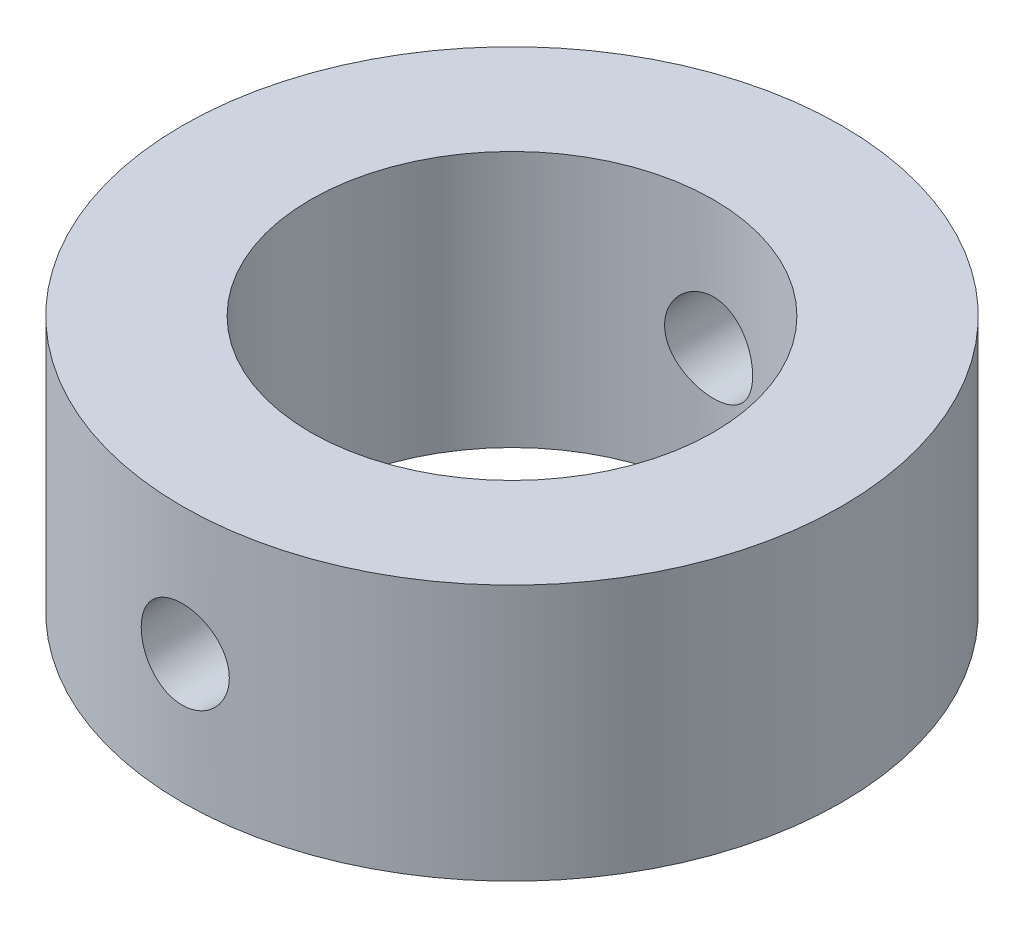
ISO-10303-21;
HEADER;
FILE_DESCRIPTION(('STEP AP214'),'2;1');
FILE_NAME('part.step','',(''),(''),'','','');
FILE_SCHEMA(('AUTOMOTIVE_DESIGN { 1 0 10303 214 1 1 1 1 }'));
ENDSEC;
DATA;
#1=APPLICATION_CONTEXT('core data for automotive mechanical design processes');
#2=APPLICATION_PROTOCOL_DEFINITION('international standard','automotive_design',2000,#1);
#3=PRODUCT_CONTEXT('',#1,'mechanical');
#4=PRODUCT('Part','Part','',(#3));
#5=PRODUCT_RELATED_PRODUCT_CATEGORY('part','',(#4));
#6=PRODUCT_DEFINITION_FORMATION('','',#4);
#7=PRODUCT_DEFINITION_CONTEXT('part definition',#1,'design');
#8=PRODUCT_DEFINITION('design','',#6,#7);
#9=PRODUCT_DEFINITION_SHAPE('','',#8);
#10=(LENGTH_UNIT() NAMED_UNIT(*) SI_UNIT(.MILLI.,.METRE.));
#11=(NAMED_UNIT(*) PLANE_ANGLE_UNIT() SI_UNIT($,.RADIAN.));
#12=(NAMED_UNIT(*) SI_UNIT($,.STERADIAN.) SOLID_ANGLE_UNIT());
#13=UNCERTAINTY_MEASURE_WITH_UNIT(LENGTH_MEASURE(1.E-05),#10,'distance_accuracy_value','');
#14=(GEOMETRIC_REPRESENTATION_CONTEXT(3) GLOBAL_UNCERTAINTY_ASSIGNED_CONTEXT((#13)) GLOBAL_UNIT_ASSIGNED_CONTEXT((#10,
#11,#12)) REPRESENTATION_CONTEXT('',''));
#15=CARTESIAN_POINT('',(0.,0.,0.));
#16=DIRECTION('',(0.,0.,1.));
#17=DIRECTION('',(1.,0.,0.));
#18=AXIS2_PLACEMENT_3D('',#15,#16,#17);
#19=CARTESIAN_POINT('',(0.,14.,0.));
#20=DIRECTION('',(0.,1.,0.));
#21=DIRECTION('',(0.,0.,1.));
#22=AXIS2_PLACEMENT_3D('',#19,#20,#21);
#23=PLANE('',#22);
#24=CARTESIAN_POINT('',(0.,14.,0.));
#25=DIRECTION('',(0.,1.,0.));
#26=DIRECTION('',(0.,0.,1.));
#27=AXIS2_PLACEMENT_3D('',#24,#25,#26);
#28=CIRCLE('',#27,18.);
#29=CARTESIAN_POINT('',(0.,14.,18.));
#30=VERTEX_POINT('',#29);
#31=EDGE_CURVE('E10',#30,#30,#28,.T.);
#32=ORIENTED_EDGE('',*,*,#31,.T.);
#33=EDGE_LOOP('',(#32));
#34=FACE_BOUND('',#33,.T.);
#35=CARTESIAN_POINT('',(0.,14.,0.));
#36=DIRECTION('',(0.,1.,0.));
#37=DIRECTION('',(0.,0.,1.));
#38=AXIS2_PLACEMENT_3D('',#35,#36,#37);
#39=CIRCLE('',#38,11.);
#40=CARTESIAN_POINT('',(0.,14.,11.));
#41=VERTEX_POINT('',#40);
#42=EDGE_CURVE('E50',#41,#41,#39,.T.);
#43=ORIENTED_EDGE('',*,*,#42,.F.);
#44=EDGE_LOOP('',(#43));
#45=FACE_BOUND('',#44,.T.);
#46=ADVANCED_FACE('F32',(#34,#45),#23,.T.);
#47=CARTESIAN_POINT('',(0.,0.,0.));
#48=DIRECTION('',(0.,1.,0.));
#49=DIRECTION('',(0.,0.,1.));
#50=AXIS2_PLACEMENT_3D('',#47,#48,#49);
#51=PLANE('',#50);
#52=CARTESIAN_POINT('',(0.,0.,0.));
#53=DIRECTION('',(0.,1.,0.));
#54=DIRECTION('',(0.,0.,1.));
#55=AXIS2_PLACEMENT_3D('',#52,#53,#54);
#56=CIRCLE('',#55,18.);
#57=CARTESIAN_POINT('',(0.,0.,18.));
#58=VERTEX_POINT('',#57);
#59=EDGE_CURVE('E45',#58,#58,#56,.T.);
#60=ORIENTED_EDGE('',*,*,#59,.F.);
#61=EDGE_LOOP('',(#60));
#62=FACE_BOUND('',#61,.T.);
#63=CARTESIAN_POINT('',(0.,0.,0.));
#64=DIRECTION('',(0.,1.,0.));
#65=DIRECTION('',(0.,0.,1.));
#66=AXIS2_PLACEMENT_3D('',#63,#64,#65);
#67=CIRCLE('',#66,11.);
#68=CARTESIAN_POINT('',(0.,0.,11.));
#69=VERTEX_POINT('',#68);
#70=EDGE_CURVE('E53',#69,#69,#67,.T.);
#71=ORIENTED_EDGE('',*,*,#70,.T.);
#72=EDGE_LOOP('',(#71));
#73=FACE_BOUND('',#72,.T.);
#74=ADVANCED_FACE('F86',(#62,#73),#51,.F.);
#75=CARTESIAN_POINT('',(0.,14.,0.));
#76=DIRECTION('',(0.,-1.,0.));
#77=DIRECTION('',(0.,0.,-1.));
#78=AXIS2_PLACEMENT_3D('',#75,#76,#77);
#79=CYLINDRICAL_SURFACE('',#78,18.);
#80=CARTESIAN_POINT('',(0.,9.40419518636851,-18.));
#81=CARTESIAN_POINT('',(-0.134402909675661,9.4041895263878,-17.999998022804));
#82=CARTESIAN_POINT('',(-0.268887876598331,9.39288678116429,-17.9984787957574));
#83=CARTESIAN_POINT('',(-0.534110132817522,9.34797940860613,-17.9925644552418));
#84=CARTESIAN_POINT('',(-0.66484345158847,9.31435200093208,-17.9881664042527));
#85=CARTESIAN_POINT('',(-0.918684809940585,9.22580837495953,-17.9769894865157));
#86=CARTESIAN_POINT('',(-1.04179811709146,9.17090705791465,-17.9702122865483));
#87=CARTESIAN_POINT('',(-1.27704218619369,9.04140793786261,-17.9550292525406));
#88=CARTESIAN_POINT('',(-1.38917471162932,8.96681330468474,-17.9466236806605));
#89=CARTESIAN_POINT('',(-1.59999709392872,8.79954706606402,-17.9290624099257));
#90=CARTESIAN_POINT('',(-1.69860838354534,8.70677683656236,-17.919902784145));
#91=CARTESIAN_POINT('',(-1.87891202144109,8.50600478201258,-17.9018971115974));
#92=CARTESIAN_POINT('',(-1.96060347320391,8.39800215036823,-17.8930510814673));
#93=CARTESIAN_POINT('',(-2.10504565771609,8.16931461634919,-17.8766357689477));
#94=CARTESIAN_POINT('',(-2.16772196734186,8.04858231223054,-17.8690715531205));
#95=CARTESIAN_POINT('',(-2.27187933943463,7.79818735767253,-17.8561287998479));
#96=CARTESIAN_POINT('',(-2.31336131778918,7.6685250934055,-17.8507501679571));
#97=CARTESIAN_POINT('',(-2.37371196241599,7.40477015856092,-17.8428255002783));
#98=CARTESIAN_POINT('',(-2.39271394591524,7.27070850317503,-17.8402627713486));
#99=CARTESIAN_POINT('',(-2.40797788886755,7.00127657771045,-17.8382091402811));
#100=CARTESIAN_POINT('',(-2.40424088831466,6.86590636776276,-17.8387180976563));
#101=CARTESIAN_POINT('',(-2.37424222007565,6.59863316161741,-17.8427350578061));
#102=CARTESIAN_POINT('',(-2.34812792753755,6.4667132870608,-17.8462234378392));
#103=CARTESIAN_POINT('',(-2.27434615054616,6.20914496292422,-17.8557755737783));
#104=CARTESIAN_POINT('',(-2.22667817309581,6.08349665686671,-17.8618393885922));
#105=CARTESIAN_POINT('',(-2.110985401575,5.8415833756402,-17.8758812247654));
#106=CARTESIAN_POINT('',(-2.04289708869425,5.72534913766053,-17.883865203344));
#107=CARTESIAN_POINT('',(-1.88834179514941,5.50590045556879,-17.9008432745791));
#108=CARTESIAN_POINT('',(-1.80187385551557,5.40268669125688,-17.9098374199302));
#109=CARTESIAN_POINT('',(-1.61219956890055,5.21135380866757,-17.9279094801919));
#110=CARTESIAN_POINT('',(-1.50886629385422,5.12336047880349,-17.9369874952112));
#111=CARTESIAN_POINT('',(-1.28883018209317,4.9659474590285,-17.9541380713651));
#112=CARTESIAN_POINT('',(-1.17212730663112,4.89652782294919,-17.9622106295857));
#113=CARTESIAN_POINT('',(-0.928563877739315,4.77823062003347,-17.9764467818395));
#114=CARTESIAN_POINT('',(-0.801699163855729,4.729361518691,-17.982609588904));
#115=CARTESIAN_POINT('',(-0.541463599173217,4.65365550875152,-17.9923249321777));
#116=CARTESIAN_POINT('',(-0.408093096852119,4.62681742144915,-17.9958776080331));
#117=CARTESIAN_POINT('',(-0.139718834510877,4.59609966961422,-17.9999541392616));
#118=CARTESIAN_POINT('',(-0.00473522850228249,4.59204683862693,-18.0005008391531));
#119=CARTESIAN_POINT('',(0.263986013014001,4.6065568012091,-17.9985656630603));
#120=CARTESIAN_POINT('',(0.397723678832998,4.62511904314237,-17.9960838609483));
#121=CARTESIAN_POINT('',(0.659641379696378,4.68418832615822,-17.9883847233057));
#122=CARTESIAN_POINT('',(0.787840497849758,4.72461221788794,-17.9831777551701));
#123=CARTESIAN_POINT('',(1.03564058949088,4.82617046882212,-17.970610873135));
#124=CARTESIAN_POINT('',(1.15524123367274,4.88730562071844,-17.9632508768332));
#125=CARTESIAN_POINT('',(1.38321890020288,5.02896584528855,-17.9471406665976));
#126=CARTESIAN_POINT('',(1.49152618583392,5.10960223534401,-17.9383825732665));
#127=CARTESIAN_POINT('',(1.69313177965956,5.28781929644873,-17.9204790044974));
#128=CARTESIAN_POINT('',(1.78642940361382,5.38540073954492,-17.9113335114233));
#129=CARTESIAN_POINT('',(1.95598678479201,5.59550340212277,-17.8936147729776));
#130=CARTESIAN_POINT('',(2.03213132657913,5.70811800231741,-17.8850456535931));
#131=CARTESIAN_POINT('',(2.16442355394526,5.94463997534317,-17.8695194696728));
#132=CARTESIAN_POINT('',(2.22057168735687,6.06854709519289,-17.862562369036));
#133=CARTESIAN_POINT('',(2.31109327727748,6.32377420900908,-17.8510766583747));
#134=CARTESIAN_POINT('',(2.34553029162468,6.45507132839894,-17.8465409658708));
#135=CARTESIAN_POINT('',(2.39185606623191,6.72164957356932,-17.8403918041939));
#136=CARTESIAN_POINT('',(2.40374603714137,6.85693048504649,-17.8387781781226));
#137=CARTESIAN_POINT('',(2.40461586754386,7.12648932422166,-17.8386608530165));
#138=CARTESIAN_POINT('',(2.39377677121566,7.26076669268346,-17.8401325781637));
#139=CARTESIAN_POINT('',(2.34988101070407,7.52557218125477,-17.8459671089652));
#140=CARTESIAN_POINT('',(2.31682435517287,7.65610030282432,-17.8503299134936));
#141=CARTESIAN_POINT('',(2.22949089079203,7.90966968781965,-17.8614471033172));
#142=CARTESIAN_POINT('',(2.17522408767461,8.03271444988355,-17.8682003607921));
#143=CARTESIAN_POINT('',(2.04702855682032,8.267981223766,-17.8833392232777));
#144=CARTESIAN_POINT('',(1.97309944561294,8.38020302444808,-17.8917248601236));
#145=CARTESIAN_POINT('',(1.80701046187046,8.59156212619291,-17.9092635227792));
#146=CARTESIAN_POINT('',(1.71471587682094,8.69059313222423,-17.9184219124302));
#147=CARTESIAN_POINT('',(1.51479885194181,8.87182916073039,-17.936427614613));
#148=CARTESIAN_POINT('',(1.40717282193679,8.95403023110731,-17.9452748536757));
#149=CARTESIAN_POINT('',(1.17910732111693,9.09958215667919,-17.9617043450202));
#150=CARTESIAN_POINT('',(1.05861432318542,9.16284974587909,-17.9692809469428));
#151=CARTESIAN_POINT('',(0.80867610420386,9.26815967624623,-17.9822590284389));
#152=CARTESIAN_POINT('',(0.679240634220725,9.3102247343844,-17.9876628347435));
#153=CARTESIAN_POINT('',(0.457635835144013,9.36203484475127,-17.9944059442382));
#154=CARTESIAN_POINT('',(0.366855081823569,9.37782179357509,-17.9964933185187));
#155=CARTESIAN_POINT('',(0.184062375153735,9.3989038560966,-17.9992910173713));
#156=CARTESIAN_POINT('',(0.0920504327256995,9.40419906280002,-18.0000013541503));
#157=CARTESIAN_POINT('',(0.,9.40419518636851,-18.));
#158=B_SPLINE_CURVE_WITH_KNOTS('',3,(#80,#81,#82,#83,#84,#85,#86,#87,#88,#89,#90,#91,#92,#93,
#94,#95,#96,#97,#98,#99,#100,#101,#102,#103,#104,#105,#106,#107,#108,#109,#110,#111,#112,#113,
#114,#115,#116,#117,#118,#119,#120,#121,#122,#123,#124,#125,#126,#127,#128,#129,#130,#131,#132,
#133,#134,#135,#136,#137,#138,#139,#140,#141,#142,#143,#144,#145,#146,#147,#148,#149,#150,#151,
#152,#153,#154,#155,#156,#157),.UNSPECIFIED.,.T.,.F.,(4,2,2,2,2,2,2,2,2,2,2,2,2,2,2,2,2,2,2,2,2,
2,2,2,2,2,2,2,2,2,2,2,2,2,2,2,2,2,4),(0.,0.402872456728005,0.806156642260637,1.2091588575875,
1.61209624532516,2.01728382669796,2.42249287189329,2.82926798626793,3.23602552085755,
3.64035849746487,4.04467298156945,4.44634496862819,4.84802614358781,5.25096996712785,
5.65393481970366,6.06008548306967,6.46623732355769,6.87255630888564,7.27885355388034,
7.68205874878093,8.08525410873084,8.48692661728587,8.88861450097985,9.29265179725614,
9.69670750702689,10.1034012551088,10.5100858944463,10.9155743952597,11.3210411230044,
11.7232904528582,12.1255396260637,12.5275992697474,12.9296667553041,13.3348000346828,
13.7400283408433,14.1470134271144,14.5535615265702,14.8294849631328,15.1054059537167),.UNSPECIFIED.);
#159=CARTESIAN_POINT('',(0.,9.40419518636851,-18.));
#160=VERTEX_POINT('',#159);
#161=EDGE_CURVE('E76',#160,#160,#158,.T.);
#162=ORIENTED_EDGE('',*,*,#161,.T.);
#163=EDGE_LOOP('',(#162));
#164=FACE_BOUND('',#163,.T.);
#165=CARTESIAN_POINT('',(2.40419518636851,7.,17.8387175970091));
#166=CARTESIAN_POINT('',(2.40418952112915,6.86560311887629,17.8387196409227));
#167=CARTESIAN_POINT('',(2.39288775560959,6.73112416327881,17.8402528262396));
#168=CARTESIAN_POINT('',(2.34798462786063,6.46591439540802,17.846217004814));
#169=CARTESIAN_POINT('',(2.314360463885,6.33518755841768,17.8506509610656));
#170=CARTESIAN_POINT('',(2.22582632511201,6.08135991146843,17.8619057093574));
#171=CARTESIAN_POINT('',(2.1709314052546,5.95825377906642,17.8687248129151));
#172=CARTESIAN_POINT('',(2.04144735425953,5.72302175213999,17.8839794931254));
#173=CARTESIAN_POINT('',(1.9668613774692,5.61089410289209,17.8924148108145));
#174=CARTESIAN_POINT('',(1.79960391838219,5.40006629849917,17.9100116316948));
#175=CARTESIAN_POINT('',(1.70683187492632,5.30144623528562,17.9191769963174));
#176=CARTESIAN_POINT('',(1.5060524974238,5.12112564011887,17.9371665710491));
#177=CARTESIAN_POINT('',(1.39804438084255,5.03942597774072,17.9459907636058));
#178=CARTESIAN_POINT('',(1.16935195768186,4.89497514057198,17.9623435903428));
#179=CARTESIAN_POINT('',(1.04862119299675,4.83229689928055,17.9698671914217));
#180=CARTESIAN_POINT('',(0.798229581593046,4.72813553245386,17.9827285733034));
#181=CARTESIAN_POINT('',(0.668569111645822,4.68665151329101,17.9880664462628));
#182=CARTESIAN_POINT('',(0.404820010485618,4.62629670269534,17.9959277249922));
#183=CARTESIAN_POINT('',(0.270762438391361,4.60729238223268,17.9984677437041));
#184=CARTESIAN_POINT('',(0.00133853311349926,4.59202235021708,18.0005039230233));
#185=CARTESIAN_POINT('',(-0.134027741441803,4.59575562471673,18.0000002193606));
#186=CARTESIAN_POINT('',(-0.401317198814035,4.62574832634919,17.9960190942246));
#187=CARTESIAN_POINT('',(-0.533256819763821,4.65186413165317,17.9925606329673));
#188=CARTESIAN_POINT('',(-0.790863853012043,4.72565575258536,17.9830797983932));
#189=CARTESIAN_POINT('',(-0.916531131949507,4.77333202641024,17.9770573705879));
#190=CARTESIAN_POINT('',(-1.15846767329025,4.88904211304471,17.9630926039775));
#191=CARTESIAN_POINT('',(-1.27470712353671,4.9571375317489,17.9551444693237));
#192=CARTESIAN_POINT('',(-1.49416323017686,5.11170806513161,17.9382164345128));
#193=CARTESIAN_POINT('',(-1.59737920469168,5.19818414154274,17.929236480379));
#194=CARTESIAN_POINT('',(-1.78870314925134,5.38786428476126,17.9111659610591));
#195=CARTESIAN_POINT('',(-1.87668696607524,5.49119359732146,17.9020750795022));
#196=CARTESIAN_POINT('',(-2.03408266779731,5.71121836163113,17.8848761860899));
#197=CARTESIAN_POINT('',(-2.103494478576,5.82791386672141,17.8767681781573));
#198=CARTESIAN_POINT('',(-2.22178601704337,6.07147512347324,17.8624532550841));
#199=CARTESIAN_POINT('',(-2.27065489419373,6.19834620773688,17.8562473450771));
#200=CARTESIAN_POINT('',(-2.34635851170631,6.45859564511261,17.8464582560646));
#201=CARTESIAN_POINT('',(-2.37319447050536,6.59197363795559,17.8428749320295));
#202=CARTESIAN_POINT('',(-2.40390417579597,6.86035166037891,17.8387636020395));
#203=CARTESIAN_POINT('',(-2.40795305373094,6.99533130639282,17.8382122940978));
#204=CARTESIAN_POINT('',(-2.39343659829222,7.26404368490502,17.840165716245));
#205=CARTESIAN_POINT('',(-2.37487181721616,7.39777644777579,17.8426703716975));
#206=CARTESIAN_POINT('',(-2.3158028401304,7.65966834808533,17.8504322023368));
#207=CARTESIAN_POINT('',(-2.27538423446258,7.78784713610387,17.8556786367026));
#208=CARTESIAN_POINT('',(-2.17384334610543,8.03560889931053,17.8683241339554));
#209=CARTESIAN_POINT('',(-2.11272023924093,8.15519153208544,17.8757232825328));
#210=CARTESIAN_POINT('',(-1.97107799287816,8.38315647868382,17.8918960393151));
#211=CARTESIAN_POINT('',(-1.890444482657,8.49146715360608,17.9006776413389));
#212=CARTESIAN_POINT('',(-1.71223112399346,8.69308092265379,17.9186010851019));
#213=CARTESIAN_POINT('',(-1.61465052074229,8.78638334796818,17.9277429428727));
#214=CARTESIAN_POINT('',(-1.40454585890737,8.95595174554782,17.9454288351087));
#215=CARTESIAN_POINT('',(-1.29192825100107,9.03210231832972,17.9539685691755));
#216=CARTESIAN_POINT('',(-1.05539859296844,9.16440511813104,17.9694229284876));
#217=CARTESIAN_POINT('',(-0.931486797732223,9.22055779632776,17.9763375903954));
#218=CARTESIAN_POINT('',(-0.67626211726337,9.31108225743082,17.9877437083179));
#219=CARTESIAN_POINT('',(-0.544972812207559,9.3455195662915,17.9922424482032));
#220=CARTESIAN_POINT('',(-0.278411099552119,9.39184857548327,17.9983401941488));
#221=CARTESIAN_POINT('',(-0.143138898728988,9.40374144414571,17.9999393504754));
#222=CARTESIAN_POINT('',(0.126424418440943,9.40461999102004,18.0000567840976));
#223=CARTESIAN_POINT('',(0.260714980238535,9.39378315875493,17.998598932686));
#224=CARTESIAN_POINT('',(0.525547435431626,9.34988729674025,17.9928138127794));
#225=CARTESIAN_POINT('',(0.656089334157384,9.31682829859021,17.9884865483646));
#226=CARTESIAN_POINT('',(0.909687286793255,9.22948466384855,17.977446548992));
#227=CARTESIAN_POINT('',(1.03274674685421,9.17520977001078,17.9707349091149));
#228=CARTESIAN_POINT('',(1.26803955939746,9.04699348772755,17.9556673931061));
#229=CARTESIAN_POINT('',(1.38027270988521,8.97305173243943,17.9473114863051));
#230=CARTESIAN_POINT('',(1.59163190009809,8.80694852795698,17.9298091324652));
#231=CARTESIAN_POINT('',(1.69065391753013,8.7146552779584,17.9206572531379));
#232=CARTESIAN_POINT('',(1.87187243213963,8.51474466391408,17.90263692844));
#233=CARTESIAN_POINT('',(1.95406495326472,8.40712368877641,17.8937685504647));
#234=CARTESIAN_POINT('',(2.09960730711735,8.17906261292469,17.8772775827094));
#235=CARTESIAN_POINT('',(2.16287243257441,8.05856806529184,17.869660660176));
#236=CARTESIAN_POINT('',(2.26817733218579,7.80862662770416,17.8566013598538));
#237=CARTESIAN_POINT('',(2.31023985193193,7.67918950139714,17.8511566530833));
#238=CARTESIAN_POINT('',(2.36204307335285,7.45759143693355,17.8443597838653));
#239=CARTESIAN_POINT('',(2.3778269236746,7.36681955673816,17.8422547172475));
#240=CARTESIAN_POINT('',(2.39890487205194,7.18404460830521,17.8394329302926));
#241=CARTESIAN_POINT('',(2.40419906620125,7.092041551354,17.8387161972372));
#242=CARTESIAN_POINT('',(2.40419518636851,7.,17.8387175970091));
#243=B_SPLINE_CURVE_WITH_KNOTS('',3,(#165,#166,#167,#168,#169,#170,#171,#172,#173,#174,#175,
#176,#177,#178,#179,#180,#181,#182,#183,#184,#185,#186,#187,#188,#189,#190,#191,#192,#193,#194,
#195,#196,#197,#198,#199,#200,#201,#202,#203,#204,#205,#206,#207,#208,#209,#210,#211,#212,#213,
#214,#215,#216,#217,#218,#219,#220,#221,#222,#223,#224,#225,#226,#227,#228,#229,#230,#231,#232,
#233,#234,#235,#236,#237,#238,#239,#240,#241,#242),.UNSPECIFIED.,.T.,.F.,(4,2,2,2,2,2,2,2,2,2,2,
2,2,2,2,2,2,2,2,2,2,2,2,2,2,2,2,2,2,2,2,2,2,2,2,2,2,2,4),(0.,0.402854345078929,
0.806120829800053,1.20910241182785,1.61201947860928,2.01723076662861,2.42246287414509,
2.82922967624751,3.23597932612609,3.64030055943988,4.04460376281382,4.44633193534391,
4.84806864568285,5.25102983035316,5.65401210438611,6.06013839042749,6.46626629726422,
6.87260844741642,7.27892812503046,7.68212069957521,8.08530342706948,8.48691841103621,
8.88854938379678,9.29259433818722,9.69665729300613,10.1033626067798,10.5100587441956,
10.9155217316384,11.3209637060036,11.7232514945912,12.1255387111338,12.5276414061443,
12.9297516020347,13.3348614663304,13.7400669296978,14.1470596085513,14.5536147422936,
14.829511610302,15.1054059508607),.UNSPECIFIED.);
#244=CARTESIAN_POINT('',(2.40419518636851,7.,17.8387175970091));
#245=VERTEX_POINT('',#244);
#246=EDGE_CURVE('E72',#245,#245,#243,.T.);
#247=ORIENTED_EDGE('',*,*,#246,.T.);
#248=EDGE_LOOP('',(#247));
#249=FACE_BOUND('',#248,.T.);
#250=ORIENTED_EDGE('',*,*,#31,.F.);
#251=EDGE_LOOP('',(#250));
#252=FACE_BOUND('',#251,.T.);
#253=ORIENTED_EDGE('',*,*,#59,.T.);
#254=EDGE_LOOP('',(#253));
#255=FACE_BOUND('',#254,.T.);
#256=ADVANCED_FACE('F34',(#164,#249,#252,#255),#79,.T.);
#257=CARTESIAN_POINT('',(0.,14.,0.));
#258=DIRECTION('',(0.,-1.,0.));
#259=DIRECTION('',(0.,0.,-1.));
#260=AXIS2_PLACEMENT_3D('',#257,#258,#259);
#261=CYLINDRICAL_SURFACE('',#260,11.);
#262=CARTESIAN_POINT('',(0.,9.40419518636851,-11.));
#263=CARTESIAN_POINT('',(-0.133345474822226,9.40419062909923,-10.9999975400844));
#264=CARTESIAN_POINT('',(-0.266746044124557,9.39306399091577,-10.9975506752606));
#265=CARTESIAN_POINT('',(-0.52975815160191,9.34889753073652,-10.9880259858541));
#266=CARTESIAN_POINT('',(-0.659366910176056,9.3158420341455,-10.9809448487746));
#267=CARTESIAN_POINT('',(-0.910956292024676,9.22890251764311,-10.9629400634831));
#268=CARTESIAN_POINT('',(-1.03294472350294,9.17504023811171,-10.9520204270716));
#269=CARTESIAN_POINT('',(-1.26614873297863,9.04808505658846,-10.9275172572127));
#270=CARTESIAN_POINT('',(-1.37736459300546,8.97499265823362,-10.9139337935332));
#271=CARTESIAN_POINT('',(-1.58765291479783,8.81041257091474,-10.8853477064138));
#272=CARTESIAN_POINT('',(-1.68652804672556,8.71867578001747,-10.8703275037491));
#273=CARTESIAN_POINT('',(-1.86761721061673,8.51994575803247,-10.8406847135783));
#274=CARTESIAN_POINT('',(-1.94982975878706,8.41295116969101,-10.826062161583));
#275=CARTESIAN_POINT('',(-2.09613040319014,8.18528408958115,-10.798696969245));
#276=CARTESIAN_POINT('',(-2.16000847894671,8.06447368759022,-10.7859768549993));
#277=CARTESIAN_POINT('',(-2.2664797484557,7.81350925979558,-10.7641090380261));
#278=CARTESIAN_POINT('',(-2.30907548311454,7.68335635152008,-10.7549609088666));
#279=CARTESIAN_POINT('',(-2.37112088792617,7.41954183972089,-10.7414518583969));
#280=CARTESIAN_POINT('',(-2.39091990197836,7.28596617158421,-10.7370187653363));
#281=CARTESIAN_POINT('',(-2.40789607083883,7.01732121154156,-10.7332249531352));
#282=CARTESIAN_POINT('',(-2.40507600192406,6.88225210497317,-10.7338636114855));
#283=CARTESIAN_POINT('',(-2.37717520068272,6.61705114870122,-10.7400758009444));
#284=CARTESIAN_POINT('',(-2.35250025123275,6.48687418151104,-10.7455593712936));
#285=CARTESIAN_POINT('',(-2.28223298243534,6.23255335677272,-10.7607012958921));
#286=CARTESIAN_POINT('',(-2.23663949111248,6.10840983768361,-10.7703598840479));
#287=CARTESIAN_POINT('',(-2.12545663317038,5.86853887574986,-10.7928522453492));
#288=CARTESIAN_POINT('',(-2.05971119259516,5.75288618062185,-10.8057106489451));
#289=CARTESIAN_POINT('',(-1.91020045506305,5.53410451460627,-10.8331387084785));
#290=CARTESIAN_POINT('',(-1.82643270524183,5.43097725144154,-10.8477085972291));
#291=CARTESIAN_POINT('',(-1.64110698892313,5.23783759909056,-10.877303983339));
#292=CARTESIAN_POINT('',(-1.5392039624412,5.14815645001999,-10.8923325256613));
#293=CARTESIAN_POINT('',(-1.32163450809266,4.98710277961137,-10.9208653886596));
#294=CARTESIAN_POINT('',(-1.20596783169232,4.91573058895629,-10.9343696818033));
#295=CARTESIAN_POINT('',(-0.963750440342864,4.79323915430486,-10.9583762082612));
#296=CARTESIAN_POINT('',(-0.837177121471474,4.74216326545735,-10.9688720019103));
#297=CARTESIAN_POINT('',(-0.576964118492669,4.66209712791832,-10.9856310569749));
#298=CARTESIAN_POINT('',(-0.443325463395197,4.63310367252048,-10.9918949329143));
#299=CARTESIAN_POINT('',(-0.175616630849168,4.59850709209895,-10.9993969314591));
#300=CARTESIAN_POINT('',(-0.041607575826319,4.59245148063386,-11.0007322639144));
#301=CARTESIAN_POINT('',(0.225507343154808,4.60267611184991,-10.9984991062023));
#302=CARTESIAN_POINT('',(0.358613267662854,4.61895484196886,-10.9949309481168));
#303=CARTESIAN_POINT('',(0.61864466765043,4.67301086027097,-10.9833530763986));
#304=CARTESIAN_POINT('',(0.745621847756873,4.71055086471981,-10.9753924096367));
#305=CARTESIAN_POINT('',(0.991477062096779,4.80580046988377,-10.9559205328824));
#306=CARTESIAN_POINT('',(1.11035440600934,4.86351178716692,-10.9444090207249));
#307=CARTESIAN_POINT('',(1.33850680732178,4.99840891531374,-10.9188725678397));
#308=CARTESIAN_POINT('',(1.44762083039341,5.07586060409392,-10.9048141378459));
#309=CARTESIAN_POINT('',(1.65146546084491,5.24768973118556,-10.875811752349));
#310=CARTESIAN_POINT('',(1.74619420022124,5.34206936421343,-10.8608676821908));
#311=CARTESIAN_POINT('',(1.92036779363261,5.54715147074604,-10.8314426235525));
#312=CARTESIAN_POINT('',(1.99949934992878,5.65812233332314,-10.8169752153956));
#313=CARTESIAN_POINT('',(2.13800413221102,5.89204442497026,-10.7904555654241));
#314=CARTESIAN_POINT('',(2.19737821262059,6.01499513566744,-10.7784032191779));
#315=CARTESIAN_POINT('',(2.2942820289938,6.26872782204305,-10.7581932659372));
#316=CARTESIAN_POINT('',(2.33193450475538,6.39946109674684,-10.7500138228015));
#317=CARTESIAN_POINT('',(2.38468595356046,6.66560070695832,-10.7384363659103));
#318=CARTESIAN_POINT('',(2.39978852691015,6.80100629295438,-10.735037588881));
#319=CARTESIAN_POINT('',(2.40685841879594,7.0694880652082,-10.7334543307281));
#320=CARTESIAN_POINT('',(2.39932247324612,7.20255075139882,-10.7351578913006));
#321=CARTESIAN_POINT('',(2.36243961043478,7.46546110109579,-10.7433341858523));
#322=CARTESIAN_POINT('',(2.33309294939195,7.59530880235128,-10.7498068638069));
#323=CARTESIAN_POINT('',(2.25366152206053,7.84770941626606,-10.7667375508172));
#324=CARTESIAN_POINT('',(2.20364894366445,7.97028603967343,-10.7771816772193));
#325=CARTESIAN_POINT('',(2.08436740648332,8.20538253767768,-10.8008839403652));
#326=CARTESIAN_POINT('',(2.01509644497114,8.31790136473021,-10.8141423697415));
#327=CARTESIAN_POINT('',(1.85761646279971,8.53213718814393,-10.8423138633169));
#328=CARTESIAN_POINT('',(1.76905339564455,8.6335903006525,-10.857254924738));
#329=CARTESIAN_POINT('',(1.57622077126447,8.82035798004134,-10.8869199443971));
#330=CARTESIAN_POINT('',(1.47194758829262,8.90566881115496,-10.9016438516546));
#331=CARTESIAN_POINT('',(1.24902759049567,9.05878766040772,-10.9294416873438));
#332=CARTESIAN_POINT('',(1.13021213456523,9.12635472810121,-10.9424917811503));
#333=CARTESIAN_POINT('',(0.882650713041727,9.24045202011478,-10.9652325018749));
#334=CARTESIAN_POINT('',(0.753913187645637,9.28699989813703,-10.974925946391));
#335=CARTESIAN_POINT('',(0.520871635500246,9.34943554969008,-10.9881303254897));
#336=CARTESIAN_POINT('',(0.417828901717508,9.36993125313435,-10.9925538956342));
#337=CARTESIAN_POINT('',(0.20986876639113,9.39731256422799,-10.9984896366258));
#338=CARTESIAN_POINT('',(0.10495144788536,9.40419877323195,-11.0000019361115));
#339=CARTESIAN_POINT('',(0.,9.40419518636851,-11.));
#340=B_SPLINE_CURVE_WITH_KNOTS('',3,(#262,#263,#264,#265,#266,#267,#268,#269,#270,#271,#272,
#273,#274,#275,#276,#277,#278,#279,#280,#281,#282,#283,#284,#285,#286,#287,#288,#289,#290,#291,
#292,#293,#294,#295,#296,#297,#298,#299,#300,#301,#302,#303,#304,#305,#306,#307,#308,#309,#310,
#311,#312,#313,#314,#315,#316,#317,#318,#319,#320,#321,#322,#323,#324,#325,#326,#327,#328,#329,
#330,#331,#332,#333,#334,#335,#336,#337,#338,#339),.UNSPECIFIED.,.T.,.F.,(4,2,2,2,2,2,2,2,2,2,2,
2,2,2,2,2,2,2,2,2,2,2,2,2,2,2,2,2,2,2,2,2,2,2,2,2,2,2,4),(0.,0.399652261603197,
0.799590500104639,1.19911198060419,1.59862299867337,2.00387143414728,2.40915594091199,
2.81891288470225,3.22862089576575,3.63196316013708,4.03525591884559,4.43121407500785,
4.82719441770241,5.22632256514819,5.6255050689587,6.03330636545437,6.44111502683926,
6.84979018932323,7.25840599461631,7.65891789656788,8.0594026757474,8.45550356376515,
8.85163816796885,9.25341958741895,9.65525313573388,10.0644804831351,10.4736901309616,
10.8805642660379,11.2873734328434,11.6853220381304,12.0832659686391,12.4798314411986,
12.8764381690233,13.2810505297585,13.6857564146701,14.0957028748939,14.5053043838983,
14.8198702665674,15.1344222493913),.UNSPECIFIED.);
#341=CARTESIAN_POINT('',(0.,9.40419518636851,-11.));
#342=VERTEX_POINT('',#341);
#343=EDGE_CURVE('E37',#342,#342,#340,.T.);
#344=ORIENTED_EDGE('',*,*,#343,.F.);
#345=EDGE_LOOP('',(#344));
#346=FACE_BOUND('',#345,.T.);
#347=CARTESIAN_POINT('',(2.40419518636851,7.,10.7340507501056));
#348=CARTESIAN_POINT('',(2.40419059838666,6.86669740965424,10.7340534442967));
#349=CARTESIAN_POINT('',(2.39307087271794,6.7333396486609,10.7365609556869));
#350=CARTESIAN_POINT('',(2.34893435507288,6.47041640187712,10.7463016653039));
#351=CARTESIAN_POINT('',(2.3159017165744,6.34085373139193,10.7535382833708));
#352=CARTESIAN_POINT('',(2.22902901610703,6.089362004055,10.771879358729));
#353=CARTESIAN_POINT('',(2.17521176557183,5.96742474807567,10.7829795743477));
#354=CARTESIAN_POINT('',(2.04836275908683,5.73430716245537,10.8077920246006));
#355=CARTESIAN_POINT('',(1.97533140518381,5.62312660780166,10.821504204579));
#356=CARTESIAN_POINT('',(1.81081416989867,5.41280125240152,10.8502539772752));
#357=CARTESIAN_POINT('',(1.71906546342858,5.31386431303239,10.865308502817));
#358=CARTESIAN_POINT('',(1.52028529835991,5.13265505257484,10.8948984503776));
#359=CARTESIAN_POINT('',(1.41325265401345,5.05038402564854,10.909433832011));
#360=CARTESIAN_POINT('',(1.18554943218901,4.90401989875041,10.9365321277409));
#361=CARTESIAN_POINT('',(1.06474747954355,4.84012669758062,10.9490727329579));
#362=CARTESIAN_POINT('',(0.813801279481157,4.73362516908576,10.9705772316062));
#363=CARTESIAN_POINT('',(0.683658080664218,4.69101445695895,10.9795415257571));
#364=CARTESIAN_POINT('',(0.419884883726366,4.62894115524104,10.9927637121968));
#365=CARTESIAN_POINT('',(0.286341312110702,4.60912678262392,10.9970930542228));
#366=CARTESIAN_POINT('',(0.0177600559911828,4.59210875811057,11.0008050808282));
#367=CARTESIAN_POINT('',(-0.117277456068783,4.59490252322274,11.0001883305012));
#368=CARTESIAN_POINT('',(-0.382588350041267,4.62275942601665,10.9941322756691));
#369=CARTESIAN_POINT('',(-0.512903694689677,4.64744338704654,10.9887750873282));
#370=CARTESIAN_POINT('',(-0.767496516045422,4.71777578995514,10.9739336550688));
#371=CARTESIAN_POINT('',(-0.891773719738372,4.76342517881147,10.9644492247299));
#372=CARTESIAN_POINT('',(-1.13181534297207,4.87472816637093,10.9422869149877));
#373=CARTESIAN_POINT('',(-1.24751090270665,4.94052553867325,10.9295862011024));
#374=CARTESIAN_POINT('',(-1.46635675194194,5.09014953999941,10.9023839885519));
#375=CARTESIAN_POINT('',(-1.56950533180934,5.17397862169944,10.8878822450238));
#376=CARTESIAN_POINT('',(-1.76258427684077,5.35935088762271,10.8583170449355));
#377=CARTESIAN_POINT('',(-1.85219548608085,5.46122592483005,10.8432481778152));
#378=CARTESIAN_POINT('',(-2.01312096837702,5.67871346680345,10.8145293793635));
#379=CARTESIAN_POINT('',(-2.08443474696953,5.7943263426927,10.8008794863839));
#380=CARTESIAN_POINT('',(-2.20688260981921,6.03652325727243,10.7765298921948));
#381=CARTESIAN_POINT('',(-2.2579564504998,6.16313870115375,10.7658390265023));
#382=CARTESIAN_POINT('',(-2.33800588198396,6.42344408614396,10.7487404553427));
#383=CARTESIAN_POINT('',(-2.36698497244969,6.55713290328851,10.7423320715787));
#384=CARTESIAN_POINT('',(-2.40152739660016,6.82487405238992,10.7346623593293));
#385=CARTESIAN_POINT('',(-2.40755541329454,6.95886357803811,10.7332989040541));
#386=CARTESIAN_POINT('',(-2.3972825837767,7.22593306382084,10.7355979443653));
#387=CARTESIAN_POINT('',(-2.38098326901928,7.35901308570998,10.7392600952401));
#388=CARTESIAN_POINT('',(-2.32692159768468,7.61886836032679,10.7511012838079));
#389=CARTESIAN_POINT('',(-2.28941511778119,7.74569952894783,10.7592264399928));
#390=CARTESIAN_POINT('',(-2.19428081310819,7.99127737843516,10.7790295436888));
#391=CARTESIAN_POINT('',(-2.13665106475343,8.11002328513324,10.7907078308302));
#392=CARTESIAN_POINT('',(-2.00188208176585,8.33807096775223,10.8165257716687));
#393=CARTESIAN_POINT('',(-1.92445655480147,8.44719950140654,10.8307005031557));
#394=CARTESIAN_POINT('',(-1.75266851719769,8.65108537615511,10.8598216483817));
#395=CARTESIAN_POINT('',(-1.6583039065472,8.74584093267917,10.8747681576375));
#396=CARTESIAN_POINT('',(-1.45321376221595,8.92009439035404,10.9040853628543));
#397=CARTESIAN_POINT('',(-1.34221641859282,8.99927550821673,10.9184401651824));
#398=CARTESIAN_POINT('',(-1.10822601588259,9.13786720774745,10.9446641862587));
#399=CARTESIAN_POINT('',(-0.985233516901551,9.19727871197387,10.9565335209828));
#400=CARTESIAN_POINT('',(-0.731509750681124,9.29420337428419,10.9763822317855));
#401=CARTESIAN_POINT('',(-0.600833437088551,9.33185512779438,10.9843861729612));
#402=CARTESIAN_POINT('',(-0.334815726075157,9.38462434548169,10.9957084731027));
#403=CARTESIAN_POINT('',(-0.199475008674611,9.39974508034119,10.9990275121417));
#404=CARTESIAN_POINT('',(0.0690222137089819,9.4068761692174,11.0005858870613));
#405=CARTESIAN_POINT('',(0.20216577271646,9.39935952534689,10.998929191603));
#406=CARTESIAN_POINT('',(0.465243078377383,9.3624871124751,10.9909449650638));
#407=CARTESIAN_POINT('',(0.5951768825176,9.33313173489939,10.9846175176988));
#408=CARTESIAN_POINT('',(0.847781146811231,9.25364166918495,10.9680103931837));
#409=CARTESIAN_POINT('',(0.970473579967009,9.2035739737615,10.9577434657279));
#410=CARTESIAN_POINT('',(1.20577928865063,9.08414586659116,10.934353817535));
#411=CARTESIAN_POINT('',(1.31839158599222,9.01478358515571,10.9212308200651));
#412=CARTESIAN_POINT('',(1.53264782661987,8.85719245755773,10.8932501261464));
#413=CARTESIAN_POINT('',(1.63404342475026,8.76863093902911,10.8783642651473));
#414=CARTESIAN_POINT('',(1.82069579893534,8.57582639722507,10.8486874655186));
#415=CARTESIAN_POINT('',(1.90594867962535,8.47157959983202,10.83389655063));
#416=CARTESIAN_POINT('',(2.05899159488594,8.24869057963131,10.8058643108439));
#417=CARTESIAN_POINT('',(2.12653337957298,8.1298748000206,10.7926463018462));
#418=CARTESIAN_POINT('',(2.24058331847492,7.8823154906366,10.769549590448));
#419=CARTESIAN_POINT('',(2.28710928536613,7.75358047700978,10.7596680619));
#420=CARTESIAN_POINT('',(2.3494942656627,7.52059421780658,10.7461913284028));
#421=CARTESIAN_POINT('',(2.36996779361555,7.41760734229239,10.7416688113789));
#422=CARTESIAN_POINT('',(2.39731972886495,7.20975830447388,10.7355975344348));
#423=CARTESIAN_POINT('',(2.40419879666606,7.10489623352817,10.734048630038));
#424=CARTESIAN_POINT('',(2.40419518636851,7.,10.7340507501056));
#425=B_SPLINE_CURVE_WITH_KNOTS('',3,(#347,#348,#349,#350,#351,#352,#353,#354,#355,#356,#357,
#358,#359,#360,#361,#362,#363,#364,#365,#366,#367,#368,#369,#370,#371,#372,#373,#374,#375,#376,
#377,#378,#379,#380,#381,#382,#383,#384,#385,#386,#387,#388,#389,#390,#391,#392,#393,#394,#395,
#396,#397,#398,#399,#400,#401,#402,#403,#404,#405,#406,#407,#408,#409,#410,#411,#412,#413,#414,
#415,#416,#417,#418,#419,#420,#421,#422,#423,#424),.UNSPECIFIED.,.T.,.F.,(4,2,2,2,2,2,2,2,2,2,2,
2,2,2,2,2,2,2,2,2,2,2,2,2,2,2,2,2,2,2,2,2,2,2,2,2,2,2,4),(0.,0.399523336463805,0.79933590727869,
1.19871091889099,1.598077574419,2.00349466761906,2.40894323071266,2.81864819280548,
3.2283072352491,3.63155602953158,4.03475875307852,4.43111081782042,4.82748078696464,
5.22674785470178,5.62606926519456,6.033687228658,6.44131620629143,6.85014952703765,
7.25891807783217,7.65936500369588,8.05978446386518,8.45547268322543,8.8511987368214,
9.25300812166115,9.6548673549862,10.0642056471128,10.4735248345943,10.8802073463053,
11.2868308167911,11.685017354288,12.0831967550782,12.4800982155743,12.877038150116,
13.2815015419813,13.686062410009,14.096022667516,14.5056347941322,14.8200362579055,
15.1344224456979),.UNSPECIFIED.);
#426=CARTESIAN_POINT('',(2.40419518636851,7.,10.7340507501056));
#427=VERTEX_POINT('',#426);
#428=EDGE_CURVE('E55',#427,#427,#425,.T.);
#429=ORIENTED_EDGE('',*,*,#428,.F.);
#430=EDGE_LOOP('',(#429));
#431=FACE_BOUND('',#430,.T.);
#432=ORIENTED_EDGE('',*,*,#42,.T.);
#433=EDGE_LOOP('',(#432));
#434=FACE_BOUND('',#433,.T.);
#435=ORIENTED_EDGE('',*,*,#70,.F.);
#436=EDGE_LOOP('',(#435));
#437=FACE_BOUND('',#436,.T.);
#438=ADVANCED_FACE('F59',(#346,#431,#434,#437),#261,.F.);
#439=CARTESIAN_POINT('',(0.,7.,-18.));
#440=DIRECTION('',(0.,0.,1.));
#441=DIRECTION('',(1.,0.,0.));
#442=AXIS2_PLACEMENT_3D('',#439,#440,#441);
#443=CYLINDRICAL_SURFACE('',#442,2.40419518636851);
#444=ORIENTED_EDGE('',*,*,#428,.T.);
#445=EDGE_LOOP('',(#444));
#446=FACE_BOUND('',#445,.T.);
#447=ORIENTED_EDGE('',*,*,#246,.F.);
#448=EDGE_LOOP('',(#447));
#449=FACE_BOUND('',#448,.T.);
#450=ADVANCED_FACE('F65',(#446,#449),#443,.F.);
#451=ORIENTED_EDGE('',*,*,#343,.T.);
#452=EDGE_LOOP('',(#451));
#453=FACE_BOUND('',#452,.T.);
#454=ORIENTED_EDGE('',*,*,#161,.F.);
#455=EDGE_LOOP('',(#454));
#456=FACE_BOUND('',#455,.T.);
#457=ADVANCED_FACE('F62',(#453,#456),#443,.F.);
#458=CLOSED_SHELL('',(#46,#74,#256,#438,#450,#457));
#459=MANIFOLD_SOLID_BREP('B2',#458);
#460=ADVANCED_BREP_SHAPE_REPRESENTATION('',(#18,#459),#14);
#461=SHAPE_DEFINITION_REPRESENTATION(#9,#460);
ENDSEC;
END-ISO-10303-21;
